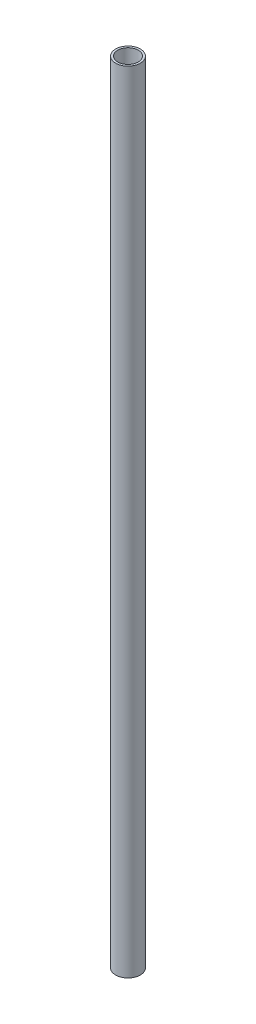
ISO-10303-21;
HEADER;
FILE_DESCRIPTION(('STEP AP214'),'2;1');
FILE_NAME('part.step','',(''),(''),'','','');
FILE_SCHEMA(('AUTOMOTIVE_DESIGN { 1 0 10303 214 1 1 1 1 }'));
ENDSEC;
DATA;
#1=APPLICATION_CONTEXT('core data for automotive mechanical design processes');
#2=APPLICATION_PROTOCOL_DEFINITION('international standard','automotive_design',2000,#1);
#3=PRODUCT_CONTEXT('',#1,'mechanical');
#4=PRODUCT('Part','Part','',(#3));
#5=PRODUCT_RELATED_PRODUCT_CATEGORY('part','',(#4));
#6=PRODUCT_DEFINITION_FORMATION('','',#4);
#7=PRODUCT_DEFINITION_CONTEXT('part definition',#1,'design');
#8=PRODUCT_DEFINITION('design','',#6,#7);
#9=PRODUCT_DEFINITION_SHAPE('','',#8);
#10=(LENGTH_UNIT() NAMED_UNIT(*) SI_UNIT(.MILLI.,.METRE.));
#11=(NAMED_UNIT(*) PLANE_ANGLE_UNIT() SI_UNIT($,.RADIAN.));
#12=(NAMED_UNIT(*) SI_UNIT($,.STERADIAN.) SOLID_ANGLE_UNIT());
#13=UNCERTAINTY_MEASURE_WITH_UNIT(LENGTH_MEASURE(1.E-05),#10,'distance_accuracy_value','');
#14=(GEOMETRIC_REPRESENTATION_CONTEXT(3) GLOBAL_UNCERTAINTY_ASSIGNED_CONTEXT((#13)) GLOBAL_UNIT_ASSIGNED_CONTEXT((#10,
#11,#12)) REPRESENTATION_CONTEXT('',''));
#15=CARTESIAN_POINT('',(0.,0.,0.));
#16=DIRECTION('',(0.,0.,1.));
#17=DIRECTION('',(1.,0.,0.));
#18=AXIS2_PLACEMENT_3D('',#15,#16,#17);
#19=CARTESIAN_POINT('',(0.,406.4,0.));
#20=DIRECTION('',(0.,1.,0.));
#21=DIRECTION('',(0.,0.,1.));
#22=AXIS2_PLACEMENT_3D('',#19,#20,#21);
#23=PLANE('',#22);
#24=CARTESIAN_POINT('',(0.,406.4,0.));
#25=DIRECTION('',(0.,1.,0.));
#26=DIRECTION('',(0.,0.,1.));
#27=AXIS2_PLACEMENT_3D('',#24,#25,#26);
#28=CIRCLE('',#27,6.35);
#29=CARTESIAN_POINT('',(0.,406.4,6.35));
#30=VERTEX_POINT('',#29);
#31=EDGE_CURVE('E10',#30,#30,#28,.T.);
#32=ORIENTED_EDGE('',*,*,#31,.T.);
#33=EDGE_LOOP('',(#32));
#34=FACE_BOUND('',#33,.T.);
#35=CARTESIAN_POINT('',(0.,406.4,0.));
#36=DIRECTION('',(0.,1.,0.));
#37=DIRECTION('',(0.,0.,1.));
#38=AXIS2_PLACEMENT_3D('',#35,#36,#37);
#39=CIRCLE('',#38,5.2832);
#40=CARTESIAN_POINT('',(0.,406.4,5.2832));
#41=VERTEX_POINT('',#40);
#42=EDGE_CURVE('E39',#41,#41,#39,.T.);
#43=ORIENTED_EDGE('',*,*,#42,.F.);
#44=EDGE_LOOP('',(#43));
#45=FACE_BOUND('',#44,.T.);
#46=ADVANCED_FACE('F28',(#34,#45),#23,.T.);
#47=CARTESIAN_POINT('',(0.,0.,0.));
#48=DIRECTION('',(0.,1.,0.));
#49=DIRECTION('',(0.,0.,1.));
#50=AXIS2_PLACEMENT_3D('',#47,#48,#49);
#51=PLANE('',#50);
#52=CARTESIAN_POINT('',(0.,0.,0.));
#53=DIRECTION('',(0.,1.,0.));
#54=DIRECTION('',(0.,0.,1.));
#55=AXIS2_PLACEMENT_3D('',#52,#53,#54);
#56=CIRCLE('',#55,6.35);
#57=CARTESIAN_POINT('',(0.,0.,6.35));
#58=VERTEX_POINT('',#57);
#59=EDGE_CURVE('E32',#58,#58,#56,.T.);
#60=ORIENTED_EDGE('',*,*,#59,.F.);
#61=EDGE_LOOP('',(#60));
#62=FACE_BOUND('',#61,.T.);
#63=CARTESIAN_POINT('',(0.,0.,0.));
#64=DIRECTION('',(0.,1.,0.));
#65=DIRECTION('',(0.,0.,1.));
#66=AXIS2_PLACEMENT_3D('',#63,#64,#65);
#67=CIRCLE('',#66,5.2832);
#68=CARTESIAN_POINT('',(0.,0.,5.2832));
#69=VERTEX_POINT('',#68);
#70=EDGE_CURVE('E41',#69,#69,#67,.T.);
#71=ORIENTED_EDGE('',*,*,#70,.T.);
#72=EDGE_LOOP('',(#71));
#73=FACE_BOUND('',#72,.T.);
#74=ADVANCED_FACE('F51',(#62,#73),#51,.F.);
#75=CARTESIAN_POINT('',(0.,406.4,0.));
#76=DIRECTION('',(0.,-1.,0.));
#77=DIRECTION('',(0.,0.,-1.));
#78=AXIS2_PLACEMENT_3D('',#75,#76,#77);
#79=CYLINDRICAL_SURFACE('',#78,6.35);
#80=ORIENTED_EDGE('',*,*,#31,.F.);
#81=EDGE_LOOP('',(#80));
#82=FACE_BOUND('',#81,.T.);
#83=ORIENTED_EDGE('',*,*,#59,.T.);
#84=EDGE_LOOP('',(#83));
#85=FACE_BOUND('',#84,.T.);
#86=ADVANCED_FACE('F30',(#82,#85),#79,.T.);
#87=CARTESIAN_POINT('',(0.,406.4,0.));
#88=DIRECTION('',(0.,-1.,0.));
#89=DIRECTION('',(0.,0.,-1.));
#90=AXIS2_PLACEMENT_3D('',#87,#88,#89);
#91=CYLINDRICAL_SURFACE('',#90,5.2832);
#92=ORIENTED_EDGE('',*,*,#42,.T.);
#93=EDGE_LOOP('',(#92));
#94=FACE_BOUND('',#93,.T.);
#95=ORIENTED_EDGE('',*,*,#70,.F.);
#96=EDGE_LOOP('',(#95));
#97=FACE_BOUND('',#96,.T.);
#98=ADVANCED_FACE('F47',(#94,#97),#91,.F.);
#99=CLOSED_SHELL('',(#46,#74,#86,#98));
#100=MANIFOLD_SOLID_BREP('B2',#99);
#101=ADVANCED_BREP_SHAPE_REPRESENTATION('',(#18,#100),#14);
#102=SHAPE_DEFINITION_REPRESENTATION(#9,#101);
ENDSEC;
END-ISO-10303-21;
